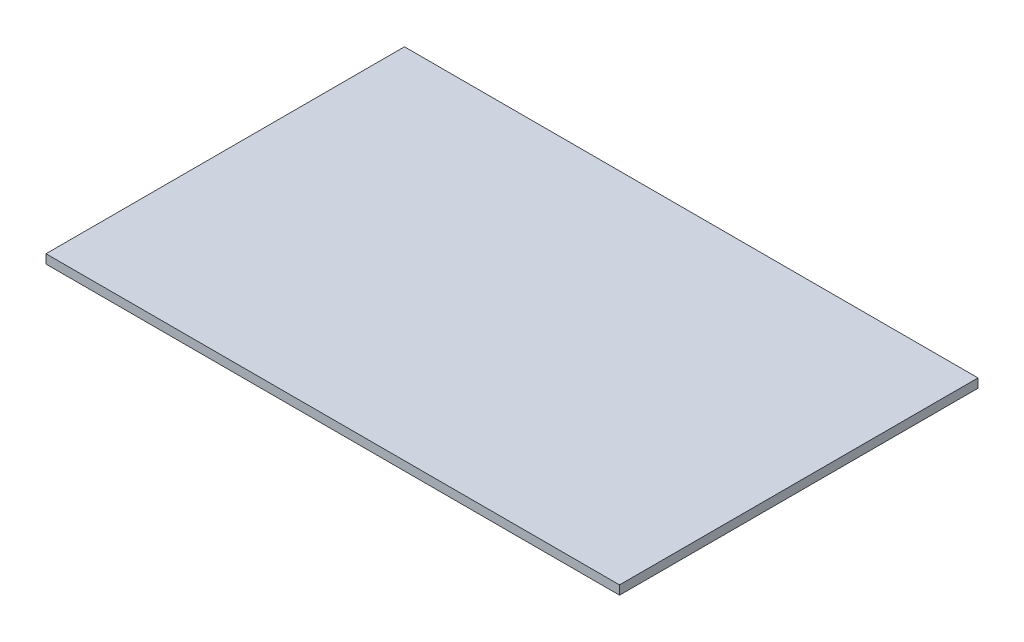
ISO-10303-21;
HEADER;
FILE_DESCRIPTION(('STEP AP214'),'2;1');
FILE_NAME('part.step','',(''),(''),'','','');
FILE_SCHEMA(('AUTOMOTIVE_DESIGN { 1 0 10303 214 1 1 1 1 }'));
ENDSEC;
DATA;
#1=APPLICATION_CONTEXT('core data for automotive mechanical design processes');
#2=APPLICATION_PROTOCOL_DEFINITION('international standard','automotive_design',2000,#1);
#3=PRODUCT_CONTEXT('',#1,'mechanical');
#4=PRODUCT('Part','Part','',(#3));
#5=PRODUCT_RELATED_PRODUCT_CATEGORY('part','',(#4));
#6=PRODUCT_DEFINITION_FORMATION('','',#4);
#7=PRODUCT_DEFINITION_CONTEXT('part definition',#1,'design');
#8=PRODUCT_DEFINITION('design','',#6,#7);
#9=PRODUCT_DEFINITION_SHAPE('','',#8);
#10=(LENGTH_UNIT() NAMED_UNIT(*) SI_UNIT(.MILLI.,.METRE.));
#11=(NAMED_UNIT(*) PLANE_ANGLE_UNIT() SI_UNIT($,.RADIAN.));
#12=(NAMED_UNIT(*) SI_UNIT($,.STERADIAN.) SOLID_ANGLE_UNIT());
#13=UNCERTAINTY_MEASURE_WITH_UNIT(LENGTH_MEASURE(1.E-05),#10,'distance_accuracy_value','');
#14=(GEOMETRIC_REPRESENTATION_CONTEXT(3) GLOBAL_UNCERTAINTY_ASSIGNED_CONTEXT((#13)) GLOBAL_UNIT_ASSIGNED_CONTEXT((#10,
#11,#12)) REPRESENTATION_CONTEXT('',''));
#15=CARTESIAN_POINT('',(0.,0.,0.));
#16=DIRECTION('',(0.,0.,1.));
#17=DIRECTION('',(1.,0.,0.));
#18=AXIS2_PLACEMENT_3D('',#15,#16,#17);
#19=CARTESIAN_POINT('',(-406.4,6.35,-254.));
#20=DIRECTION('',(1.,0.,0.));
#21=DIRECTION('',(0.,0.,-1.));
#22=AXIS2_PLACEMENT_3D('',#19,#20,#21);
#23=PLANE('',#22);
#24=DIRECTION('',(0.,0.,1.));
#25=VECTOR('',#24,1.);
#26=CARTESIAN_POINT('',(-406.4,0.,-254.));
#27=LINE('',#26,#25);
#28=CARTESIAN_POINT('',(-406.4,0.,-254.));
#29=VERTEX_POINT('',#28);
#30=CARTESIAN_POINT('',(-406.4,0.,0.));
#31=VERTEX_POINT('',#30);
#32=EDGE_CURVE('E95',#29,#31,#27,.T.);
#33=ORIENTED_EDGE('',*,*,#32,.T.);
#34=DIRECTION('',(0.,-1.,0.));
#35=VECTOR('',#34,1.);
#36=CARTESIAN_POINT('',(-406.4,6.35,0.));
#37=LINE('',#36,#35);
#38=CARTESIAN_POINT('',(-406.4,6.35,0.));
#39=VERTEX_POINT('',#38);
#40=EDGE_CURVE('E11',#39,#31,#37,.T.);
#41=ORIENTED_EDGE('',*,*,#40,.F.);
#42=DIRECTION('',(0.,0.,1.));
#43=VECTOR('',#42,1.);
#44=CARTESIAN_POINT('',(-406.4,6.35,-254.));
#45=LINE('',#44,#43);
#46=CARTESIAN_POINT('',(-406.4,6.35,-254.));
#47=VERTEX_POINT('',#46);
#48=EDGE_CURVE('E83',#47,#39,#45,.T.);
#49=ORIENTED_EDGE('',*,*,#48,.F.);
#50=DIRECTION('',(0.,-1.,0.));
#51=VECTOR('',#50,1.);
#52=CARTESIAN_POINT('',(-406.4,6.35,-254.));
#53=LINE('',#52,#51);
#54=EDGE_CURVE('E91',#47,#29,#53,.T.);
#55=ORIENTED_EDGE('',*,*,#54,.T.);
#56=EDGE_LOOP('',(#33,#41,#49,#55));
#57=FACE_BOUND('',#56,.T.);
#58=ADVANCED_FACE('F32',(#57),#23,.F.);
#59=CARTESIAN_POINT('',(-406.4,6.35,0.));
#60=DIRECTION('',(0.,0.,-1.));
#61=DIRECTION('',(-1.,0.,0.));
#62=AXIS2_PLACEMENT_3D('',#59,#60,#61);
#63=PLANE('',#62);
#64=DIRECTION('',(1.,0.,0.));
#65=VECTOR('',#64,1.);
#66=CARTESIAN_POINT('',(-406.4,0.,0.));
#67=LINE('',#66,#65);
#68=CARTESIAN_POINT('',(0.,0.,0.));
#69=VERTEX_POINT('',#68);
#70=EDGE_CURVE('E87',#31,#69,#67,.T.);
#71=ORIENTED_EDGE('',*,*,#70,.T.);
#72=DIRECTION('',(0.,-1.,0.));
#73=VECTOR('',#72,1.);
#74=CARTESIAN_POINT('',(0.,6.35,0.));
#75=LINE('',#74,#73);
#76=CARTESIAN_POINT('',(0.,6.35,0.));
#77=VERTEX_POINT('',#76);
#78=EDGE_CURVE('E40',#77,#69,#75,.T.);
#79=ORIENTED_EDGE('',*,*,#78,.F.);
#80=DIRECTION('',(1.,0.,0.));
#81=VECTOR('',#80,1.);
#82=CARTESIAN_POINT('',(-406.4,6.35,0.));
#83=LINE('',#82,#81);
#84=EDGE_CURVE('E78',#39,#77,#83,.T.);
#85=ORIENTED_EDGE('',*,*,#84,.F.);
#86=ORIENTED_EDGE('',*,*,#40,.T.);
#87=EDGE_LOOP('',(#71,#79,#85,#86));
#88=FACE_BOUND('',#87,.T.);
#89=ADVANCED_FACE('F86',(#88),#63,.F.);
#90=CARTESIAN_POINT('',(0.,6.35,-254.));
#91=DIRECTION('',(-1.,0.,0.));
#92=DIRECTION('',(0.,0.,1.));
#93=AXIS2_PLACEMENT_3D('',#90,#91,#92);
#94=PLANE('',#93);
#95=DIRECTION('',(0.,0.,-1.));
#96=VECTOR('',#95,1.);
#97=CARTESIAN_POINT('',(0.,0.,-254.));
#98=LINE('',#97,#96);
#99=CARTESIAN_POINT('',(0.,0.,-254.));
#100=VERTEX_POINT('',#99);
#101=EDGE_CURVE('E65',#69,#100,#98,.T.);
#102=ORIENTED_EDGE('',*,*,#101,.T.);
#103=DIRECTION('',(0.,-1.,0.));
#104=VECTOR('',#103,1.);
#105=CARTESIAN_POINT('',(0.,6.35,-254.));
#106=LINE('',#105,#104);
#107=CARTESIAN_POINT('',(0.,6.35,-254.));
#108=VERTEX_POINT('',#107);
#109=EDGE_CURVE('E88',#108,#100,#106,.T.);
#110=ORIENTED_EDGE('',*,*,#109,.F.);
#111=DIRECTION('',(0.,0.,-1.));
#112=VECTOR('',#111,1.);
#113=CARTESIAN_POINT('',(0.,6.35,-254.));
#114=LINE('',#113,#112);
#115=EDGE_CURVE('E81',#77,#108,#114,.T.);
#116=ORIENTED_EDGE('',*,*,#115,.F.);
#117=ORIENTED_EDGE('',*,*,#78,.T.);
#118=EDGE_LOOP('',(#102,#110,#116,#117));
#119=FACE_BOUND('',#118,.T.);
#120=ADVANCED_FACE('F89',(#119),#94,.F.);
#121=CARTESIAN_POINT('',(-406.4,6.35,-254.));
#122=DIRECTION('',(0.,0.,1.));
#123=DIRECTION('',(1.,0.,0.));
#124=AXIS2_PLACEMENT_3D('',#121,#122,#123);
#125=PLANE('',#124);
#126=DIRECTION('',(-1.,0.,0.));
#127=VECTOR('',#126,1.);
#128=CARTESIAN_POINT('',(-406.4,0.,-254.));
#129=LINE('',#128,#127);
#130=EDGE_CURVE('E71',#100,#29,#129,.T.);
#131=ORIENTED_EDGE('',*,*,#130,.T.);
#132=ORIENTED_EDGE('',*,*,#54,.F.);
#133=DIRECTION('',(-1.,0.,0.));
#134=VECTOR('',#133,1.);
#135=CARTESIAN_POINT('',(-406.4,6.35,-254.));
#136=LINE('',#135,#134);
#137=EDGE_CURVE('E48',#108,#47,#136,.T.);
#138=ORIENTED_EDGE('',*,*,#137,.F.);
#139=ORIENTED_EDGE('',*,*,#109,.T.);
#140=EDGE_LOOP('',(#131,#132,#138,#139));
#141=FACE_BOUND('',#140,.T.);
#142=ADVANCED_FACE('F102',(#141),#125,.F.);
#143=CARTESIAN_POINT('',(0.,6.35,0.));
#144=DIRECTION('',(0.,1.,0.));
#145=DIRECTION('',(0.,0.,1.));
#146=AXIS2_PLACEMENT_3D('',#143,#144,#145);
#147=PLANE('',#146);
#148=ORIENTED_EDGE('',*,*,#48,.T.);
#149=ORIENTED_EDGE('',*,*,#84,.T.);
#150=ORIENTED_EDGE('',*,*,#115,.T.);
#151=ORIENTED_EDGE('',*,*,#137,.T.);
#152=EDGE_LOOP('',(#148,#149,#150,#151));
#153=FACE_BOUND('',#152,.T.);
#154=ADVANCED_FACE('F79',(#153),#147,.T.);
#155=CARTESIAN_POINT('',(0.,0.,0.));
#156=DIRECTION('',(0.,1.,0.));
#157=DIRECTION('',(0.,0.,1.));
#158=AXIS2_PLACEMENT_3D('',#155,#156,#157);
#159=PLANE('',#158);
#160=ORIENTED_EDGE('',*,*,#32,.F.);
#161=ORIENTED_EDGE('',*,*,#130,.F.);
#162=ORIENTED_EDGE('',*,*,#101,.F.);
#163=ORIENTED_EDGE('',*,*,#70,.F.);
#164=EDGE_LOOP('',(#160,#161,#162,#163));
#165=FACE_BOUND('',#164,.T.);
#166=ADVANCED_FACE('F105',(#165),#159,.F.);
#167=CLOSED_SHELL('',(#58,#89,#120,#142,#154,#166));
#168=MANIFOLD_SOLID_BREP('B2',#167);
#169=ADVANCED_BREP_SHAPE_REPRESENTATION('',(#18,#168),#14);
#170=SHAPE_DEFINITION_REPRESENTATION(#9,#169);
ENDSEC;
END-ISO-10303-21;
